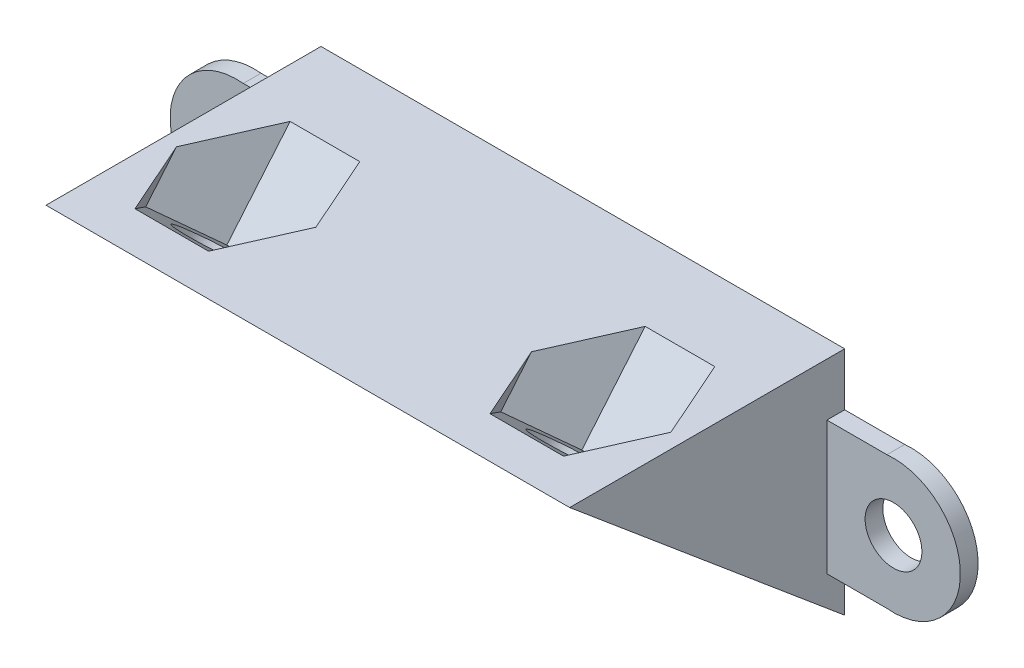
ISO-10303-21;
HEADER;
FILE_DESCRIPTION(('STEP AP214'),'2;1');
FILE_NAME('part.step','',(''),(''),'','','');
FILE_SCHEMA(('AUTOMOTIVE_DESIGN { 1 0 10303 214 1 1 1 1 }'));
ENDSEC;
DATA;
#1=APPLICATION_CONTEXT('core data for automotive mechanical design processes');
#2=APPLICATION_PROTOCOL_DEFINITION('international standard','automotive_design',2000,#1);
#3=PRODUCT_CONTEXT('',#1,'mechanical');
#4=PRODUCT('Part','Part','',(#3));
#5=PRODUCT_RELATED_PRODUCT_CATEGORY('part','',(#4));
#6=PRODUCT_DEFINITION_FORMATION('','',#4);
#7=PRODUCT_DEFINITION_CONTEXT('part definition',#1,'design');
#8=PRODUCT_DEFINITION('design','',#6,#7);
#9=PRODUCT_DEFINITION_SHAPE('','',#8);
#10=(LENGTH_UNIT() NAMED_UNIT(*) SI_UNIT(.MILLI.,.METRE.));
#11=(NAMED_UNIT(*) PLANE_ANGLE_UNIT() SI_UNIT($,.RADIAN.));
#12=(NAMED_UNIT(*) SI_UNIT($,.STERADIAN.) SOLID_ANGLE_UNIT());
#13=UNCERTAINTY_MEASURE_WITH_UNIT(LENGTH_MEASURE(1.E-05),#10,'distance_accuracy_value','');
#14=(GEOMETRIC_REPRESENTATION_CONTEXT(3) GLOBAL_UNCERTAINTY_ASSIGNED_CONTEXT((#13)) GLOBAL_UNIT_ASSIGNED_CONTEXT((#10,
#11,#12)) REPRESENTATION_CONTEXT('',''));
#15=CARTESIAN_POINT('',(0.,0.,0.));
#16=DIRECTION('',(0.,0.,1.));
#17=DIRECTION('',(1.,0.,0.));
#18=AXIS2_PLACEMENT_3D('',#15,#16,#17);
#19=CARTESIAN_POINT('',(0.,0.,1.));
#20=DIRECTION('',(0.,0.,1.));
#21=DIRECTION('',(1.,0.,0.));
#22=AXIS2_PLACEMENT_3D('',#19,#20,#21);
#23=PLANE('',#22);
#24=DIRECTION('',(0.,1.,0.));
#25=VECTOR('',#24,1.);
#26=CARTESIAN_POINT('',(0.,0.,1.));
#27=LINE('',#26,#25);
#28=CARTESIAN_POINT('',(0.,2.52312353150434,1.));
#29=VERTEX_POINT('',#28);
#30=CARTESIAN_POINT('',(0.,10.0231235315043,1.));
#31=VERTEX_POINT('',#30);
#32=EDGE_CURVE('E348',#29,#31,#27,.T.);
#33=ORIENTED_EDGE('',*,*,#32,.F.);
#34=DIRECTION('',(-1.,0.,0.));
#35=VECTOR('',#34,1.);
#36=CARTESIAN_POINT('',(0.,2.52312353150434,1.));
#37=LINE('',#36,#35);
#38=CARTESIAN_POINT('',(3.37999999999996,2.52312353150434,1.));
#39=VERTEX_POINT('',#38);
#40=EDGE_CURVE('E241',#39,#29,#37,.T.);
#41=ORIENTED_EDGE('',*,*,#40,.F.);
#42=CARTESIAN_POINT('',(3.75,6.27312353150434,1.));
#43=DIRECTION('',(0.,0.,1.));
#44=DIRECTION('',(1.,0.,0.));
#45=AXIS2_PLACEMENT_3D('',#42,#43,#44);
#46=CIRCLE('',#45,3.76820912370851);
#47=CARTESIAN_POINT('',(3.37999999999996,10.0231235315043,1.));
#48=VERTEX_POINT('',#47);
#49=EDGE_CURVE('E353',#48,#39,#46,.F.);
#50=ORIENTED_EDGE('',*,*,#49,.F.);
#51=DIRECTION('',(1.,0.,0.));
#52=VECTOR('',#51,1.);
#53=CARTESIAN_POINT('',(0.,10.0231235315043,1.));
#54=LINE('',#53,#52);
#55=EDGE_CURVE('E356',#31,#48,#54,.T.);
#56=ORIENTED_EDGE('',*,*,#55,.F.);
#57=EDGE_LOOP('',(#33,#41,#50,#56));
#58=FACE_BOUND('',#57,.T.);
#59=CARTESIAN_POINT('',(3.75,6.27312353150434,1.));
#60=DIRECTION('',(0.,0.,1.));
#61=DIRECTION('',(1.,0.,0.));
#62=AXIS2_PLACEMENT_3D('',#59,#60,#61);
#63=CIRCLE('',#62,1.59999999999999);
#64=CARTESIAN_POINT('',(5.34999999999999,6.27312353150434,1.));
#65=VERTEX_POINT('',#64);
#66=EDGE_CURVE('E368',#65,#65,#63,.T.);
#67=ORIENTED_EDGE('',*,*,#66,.F.);
#68=EDGE_LOOP('',(#67));
#69=FACE_BOUND('',#68,.T.);
#70=ADVANCED_FACE('F37',(#58,#69),#23,.T.);
#71=DIRECTION('',(0.,-1.,0.));
#72=VECTOR('',#71,1.);
#73=CARTESIAN_POINT('',(-29.5,0.,1.));
#74=LINE('',#73,#72);
#75=CARTESIAN_POINT('',(-29.5,10.0231235315044,1.));
#76=VERTEX_POINT('',#75);
#77=CARTESIAN_POINT('',(-29.5,2.52312353150435,1.));
#78=VERTEX_POINT('',#77);
#79=EDGE_CURVE('E193',#76,#78,#74,.T.);
#80=ORIENTED_EDGE('',*,*,#79,.F.);
#81=DIRECTION('',(0.999985346777663,0.0054135228786383,0.));
#82=VECTOR('',#81,1.);
#83=CARTESIAN_POINT('',(-0.0551241472471335,10.1825263763572,1.));
#84=LINE('',#83,#82);
#85=CARTESIAN_POINT('',(-32.88,10.0048255560503,1.));
#86=VERTEX_POINT('',#85);
#87=EDGE_CURVE('E359',#86,#76,#84,.T.);
#88=ORIENTED_EDGE('',*,*,#87,.F.);
#89=CARTESIAN_POINT('',(-33.25,6.27312353150435,1.));
#90=DIRECTION('',(0.,0.,1.));
#91=DIRECTION('',(1.,0.,0.));
#92=AXIS2_PLACEMENT_3D('',#89,#90,#91);
#93=CIRCLE('',#92,3.75);
#94=CARTESIAN_POINT('',(-32.88,2.54142150695845,1.));
#95=VERTEX_POINT('',#94);
#96=EDGE_CURVE('E362',#95,#86,#93,.F.);
#97=ORIENTED_EDGE('',*,*,#96,.F.);
#98=DIRECTION('',(-0.999985346777663,0.00541352287863894,0.));
#99=VECTOR('',#98,1.);
#100=CARTESIAN_POINT('',(0.0127942530315106,2.36335300344993,1.));
#101=LINE('',#100,#99);
#102=EDGE_CURVE('E365',#78,#95,#101,.T.);
#103=ORIENTED_EDGE('',*,*,#102,.F.);
#104=EDGE_LOOP('',(#80,#88,#97,#103));
#105=FACE_BOUND('',#104,.T.);
#106=CARTESIAN_POINT('',(-33.25,6.27312353150435,1.));
#107=DIRECTION('',(0.,0.,1.));
#108=DIRECTION('',(1.,0.,0.));
#109=AXIS2_PLACEMENT_3D('',#106,#107,#108);
#110=CIRCLE('',#109,1.59999999999999);
#111=CARTESIAN_POINT('',(-31.65,6.27312353150435,1.));
#112=VERTEX_POINT('',#111);
#113=EDGE_CURVE('E245',#112,#112,#110,.T.);
#114=ORIENTED_EDGE('',*,*,#113,.F.);
#115=EDGE_LOOP('',(#114));
#116=FACE_BOUND('',#115,.T.);
#117=ADVANCED_FACE('F394',(#105,#116),#23,.T.);
#118=CARTESIAN_POINT('',(0.,2.52312353150434,1.));
#119=DIRECTION('',(0.,-1.,0.));
#120=DIRECTION('',(1.,0.,0.));
#121=AXIS2_PLACEMENT_3D('',#118,#119,#120);
#122=PLANE('',#121);
#123=DIRECTION('',(-1.,0.,0.));
#124=VECTOR('',#123,1.);
#125=CARTESIAN_POINT('',(0.,2.52312353150434,0.));
#126=LINE('',#125,#124);
#127=CARTESIAN_POINT('',(3.37999999999996,2.52312353150434,0.));
#128=VERTEX_POINT('',#127);
#129=CARTESIAN_POINT('',(0.,2.52312353150434,0.));
#130=VERTEX_POINT('',#129);
#131=EDGE_CURVE('E211',#128,#130,#126,.T.);
#132=ORIENTED_EDGE('',*,*,#131,.F.);
#133=DIRECTION('',(0.,0.,-1.));
#134=VECTOR('',#133,1.);
#135=CARTESIAN_POINT('',(3.37999999999996,2.52312353150434,1.));
#136=LINE('',#135,#134);
#137=EDGE_CURVE('E258',#39,#128,#136,.T.);
#138=ORIENTED_EDGE('',*,*,#137,.F.);
#139=ORIENTED_EDGE('',*,*,#40,.T.);
#140=DIRECTION('',(0.,0.,-1.));
#141=VECTOR('',#140,1.);
#142=CARTESIAN_POINT('',(0.,2.52312353150434,1.));
#143=LINE('',#142,#141);
#144=EDGE_CURVE('E260',#29,#130,#143,.T.);
#145=ORIENTED_EDGE('',*,*,#144,.T.);
#146=EDGE_LOOP('',(#132,#138,#139,#145));
#147=FACE_BOUND('',#146,.T.);
#148=ADVANCED_FACE('F39',(#147),#122,.T.);
#149=CARTESIAN_POINT('',(3.75,6.27312353150434,1.));
#150=DIRECTION('',(0.,0.,-1.));
#151=DIRECTION('',(-1.,0.,0.));
#152=AXIS2_PLACEMENT_3D('',#149,#150,#151);
#153=CYLINDRICAL_SURFACE('',#152,3.76820912370851);
#154=CARTESIAN_POINT('',(3.75,6.27312353150434,0.));
#155=DIRECTION('',(0.,0.,1.));
#156=DIRECTION('',(1.,0.,0.));
#157=AXIS2_PLACEMENT_3D('',#154,#155,#156);
#158=CIRCLE('',#157,3.76820912370851);
#159=CARTESIAN_POINT('',(3.37999999999996,10.0231235315043,0.));
#160=VERTEX_POINT('',#159);
#161=EDGE_CURVE('E214',#160,#128,#158,.F.);
#162=ORIENTED_EDGE('',*,*,#161,.F.);
#163=DIRECTION('',(0.,0.,-1.));
#164=VECTOR('',#163,1.);
#165=CARTESIAN_POINT('',(3.37999999999996,10.0231235315043,1.));
#166=LINE('',#165,#164);
#167=EDGE_CURVE('E256',#48,#160,#166,.T.);
#168=ORIENTED_EDGE('',*,*,#167,.F.);
#169=ORIENTED_EDGE('',*,*,#49,.T.);
#170=ORIENTED_EDGE('',*,*,#137,.T.);
#171=EDGE_LOOP('',(#162,#168,#169,#170));
#172=FACE_BOUND('',#171,.T.);
#173=ADVANCED_FACE('F388',(#172),#153,.T.);
#174=CARTESIAN_POINT('',(0.,10.0231235315043,1.));
#175=DIRECTION('',(0.,1.,0.));
#176=DIRECTION('',(-1.,0.,0.));
#177=AXIS2_PLACEMENT_3D('',#174,#175,#176);
#178=PLANE('',#177);
#179=DIRECTION('',(1.,0.,0.));
#180=VECTOR('',#179,1.);
#181=CARTESIAN_POINT('',(0.,10.0231235315043,0.));
#182=LINE('',#181,#180);
#183=CARTESIAN_POINT('',(0.,10.0231235315043,0.));
#184=VERTEX_POINT('',#183);
#185=EDGE_CURVE('E218',#184,#160,#182,.T.);
#186=ORIENTED_EDGE('',*,*,#185,.F.);
#187=DIRECTION('',(0.,0.,-1.));
#188=VECTOR('',#187,1.);
#189=CARTESIAN_POINT('',(0.,10.0231235315043,1.));
#190=LINE('',#189,#188);
#191=EDGE_CURVE('E254',#31,#184,#190,.T.);
#192=ORIENTED_EDGE('',*,*,#191,.F.);
#193=ORIENTED_EDGE('',*,*,#55,.T.);
#194=ORIENTED_EDGE('',*,*,#167,.T.);
#195=EDGE_LOOP('',(#186,#192,#193,#194));
#196=FACE_BOUND('',#195,.T.);
#197=ADVANCED_FACE('F384',(#196),#178,.T.);
#198=CARTESIAN_POINT('',(0.,0.,1.));
#199=DIRECTION('',(1.,0.,0.));
#200=DIRECTION('',(0.,1.,0.));
#201=AXIS2_PLACEMENT_3D('',#198,#199,#200);
#202=PLANE('',#201);
#203=DIRECTION('',(0.,-0.642787609686538,-0.766044443118979));
#204=VECTOR('',#203,1.);
#205=CARTESIAN_POINT('',(0.,24.0989079094288,28.7199600786589));
#206=LINE('',#205,#204);
#207=CARTESIAN_POINT('',(0.,13.,15.4927967037247));
#208=VERTEX_POINT('',#207);
#209=CARTESIAN_POINT('',(0.,0.,0.));
#210=VERTEX_POINT('',#209);
#211=EDGE_CURVE('E181',#208,#210,#206,.T.);
#212=ORIENTED_EDGE('',*,*,#211,.T.);
#213=DIRECTION('',(0.,-1.,0.));
#214=VECTOR('',#213,1.);
#215=CARTESIAN_POINT('',(0.,0.,0.));
#216=LINE('',#215,#214);
#217=EDGE_CURVE('E186',#130,#210,#216,.T.);
#218=ORIENTED_EDGE('',*,*,#217,.F.);
#219=ORIENTED_EDGE('',*,*,#144,.F.);
#220=ORIENTED_EDGE('',*,*,#32,.T.);
#221=ORIENTED_EDGE('',*,*,#191,.T.);
#222=CARTESIAN_POINT('',(0.,13.,0.));
#223=VERTEX_POINT('',#222);
#224=EDGE_CURVE('E213',#223,#184,#216,.T.);
#225=ORIENTED_EDGE('',*,*,#224,.F.);
#226=DIRECTION('',(0.,0.,-1.));
#227=VECTOR('',#226,1.);
#228=CARTESIAN_POINT('',(0.,13.,1.));
#229=LINE('',#228,#227);
#230=EDGE_CURVE('E189',#208,#223,#229,.T.);
#231=ORIENTED_EDGE('',*,*,#230,.F.);
#232=EDGE_LOOP('',(#212,#218,#219,#220,#221,#225,#231));
#233=FACE_BOUND('',#232,.T.);
#234=ADVANCED_FACE('F183',(#233),#202,.T.);
#235=CARTESIAN_POINT('',(0.,13.,1.));
#236=DIRECTION('',(0.,1.,0.));
#237=DIRECTION('',(-1.,0.,0.));
#238=AXIS2_PLACEMENT_3D('',#235,#236,#237);
#239=PLANE('',#238);
#240=DIRECTION('',(-0.404481746652007,0.,-0.91454607135198));
#241=VECTOR('',#240,1.);
#242=CARTESIAN_POINT('',(-3.63587594767836,13.,2.60806054500119));
#243=LINE('',#242,#241);
#244=CARTESIAN_POINT('',(-0.824018169510542,13.,8.96576025706341));
#245=VERTEX_POINT('',#244);
#246=CARTESIAN_POINT('',(-2.78700908475527,13.,4.52737547333366));
#247=VERTEX_POINT('',#246);
#248=EDGE_CURVE('E11',#245,#247,#243,.T.);
#249=ORIENTED_EDGE('',*,*,#248,.F.);
#250=DIRECTION('',(0.404481746652007,0.,-0.914546071351981));
#251=VECTOR('',#250,1.);
#252=CARTESIAN_POINT('',(2.25746739052182,13.,1.99842356960581));
#253=LINE('',#252,#251);
#254=CARTESIAN_POINT('',(-2.67868062922069,13.,13.1592109634341));
#255=VERTEX_POINT('',#254);
#256=EDGE_CURVE('E272',#255,#245,#253,.T.);
#257=ORIENTED_EDGE('',*,*,#256,.F.);
#258=DIRECTION('',(1.,0.,0.));
#259=VECTOR('',#258,1.);
#260=CARTESIAN_POINT('',(0.,13.,13.1592109634341));
#261=LINE('',#260,#259);
#262=CARTESIAN_POINT('',(-6.8213193707793,13.,13.1592109634341));
#263=VERTEX_POINT('',#262);
#264=EDGE_CURVE('E294',#263,#255,#261,.T.);
#265=ORIENTED_EDGE('',*,*,#264,.F.);
#266=DIRECTION('',(0.404481746652007,0.,0.91454607135198));
#267=VECTOR('',#266,1.);
#268=CARTESIAN_POINT('',(-10.2032152984626,13.,5.51263689678053));
#269=LINE('',#268,#267);
#270=CARTESIAN_POINT('',(-8.67598183048946,13.,8.96576025706341));
#271=VERTEX_POINT('',#270);
#272=EDGE_CURVE('E274',#271,#263,#269,.T.);
#273=ORIENTED_EDGE('',*,*,#272,.F.);
#274=DIRECTION('',(-0.404481746652006,0.,0.914546071351981));
#275=VECTOR('',#274,1.);
#276=CARTESIAN_POINT('',(-4.30987196026239,13.,-0.90615278217352));
#277=LINE('',#276,#275);
#278=CARTESIAN_POINT('',(-6.71299091524473,13.,4.52737547333366));
#279=VERTEX_POINT('',#278);
#280=EDGE_CURVE('E276',#279,#271,#277,.T.);
#281=ORIENTED_EDGE('',*,*,#280,.F.);
#282=DIRECTION('',(-1.,0.,0.));
#283=VECTOR('',#282,1.);
#284=CARTESIAN_POINT('',(0.,13.,4.52737547333367));
#285=LINE('',#284,#283);
#286=EDGE_CURVE('E45',#247,#279,#285,.T.);
#287=ORIENTED_EDGE('',*,*,#286,.F.);
#288=EDGE_LOOP('',(#249,#257,#265,#273,#281,#287));
#289=FACE_BOUND('',#288,.T.);
#290=DIRECTION('',(-0.404481746652007,0.,-0.914546071351981));
#291=VECTOR('',#290,1.);
#292=CARTESIAN_POINT('',(-20.3637662801852,13.,10.0064043916848));
#293=LINE('',#292,#291);
#294=CARTESIAN_POINT('',(-20.8240181695105,13.,8.96576025706341));
#295=VERTEX_POINT('',#294);
#296=CARTESIAN_POINT('',(-22.7870090847553,13.,4.52737547333367));
#297=VERTEX_POINT('',#296);
#298=EDGE_CURVE('E270',#295,#297,#293,.T.);
#299=ORIENTED_EDGE('',*,*,#298,.F.);
#300=DIRECTION('',(0.404481746652007,0.,-0.914546071351981));
#301=VECTOR('',#300,1.);
#302=CARTESIAN_POINT('',(-14.470422941985,13.,-5.39992027707779));
#303=LINE('',#302,#301);
#304=CARTESIAN_POINT('',(-22.6786806292207,13.,13.1592109634342));
#305=VERTEX_POINT('',#304);
#306=EDGE_CURVE('E262',#305,#295,#303,.T.);
#307=ORIENTED_EDGE('',*,*,#306,.F.);
#308=DIRECTION('',(1.,0.,0.));
#309=VECTOR('',#308,1.);
#310=CARTESIAN_POINT('',(0.,13.,13.1592109634341));
#311=LINE('',#310,#309);
#312=CARTESIAN_POINT('',(-26.8213193707793,13.,13.1592109634342));
#313=VERTEX_POINT('',#312);
#314=EDGE_CURVE('E336',#313,#305,#311,.T.);
#315=ORIENTED_EDGE('',*,*,#314,.F.);
#316=DIRECTION('',(0.404481746652007,0.,0.914546071351981));
#317=VECTOR('',#316,1.);
#318=CARTESIAN_POINT('',(-26.9311056309694,13.,12.9109807434641));
#319=LINE('',#318,#317);
#320=CARTESIAN_POINT('',(-28.6759818304894,13.,8.9657602570634));
#321=VERTEX_POINT('',#320);
#322=EDGE_CURVE('E264',#321,#313,#319,.T.);
#323=ORIENTED_EDGE('',*,*,#322,.F.);
#324=DIRECTION('',(-0.404481746652006,0.,0.914546071351981));
#325=VECTOR('',#324,1.);
#326=CARTESIAN_POINT('',(-21.0377622927692,13.,-8.30449662885711));
#327=LINE('',#326,#325);
#328=CARTESIAN_POINT('',(-26.7129909152447,13.,4.52737547333367));
#329=VERTEX_POINT('',#328);
#330=EDGE_CURVE('E266',#329,#321,#327,.T.);
#331=ORIENTED_EDGE('',*,*,#330,.F.);
#332=DIRECTION('',(-1.,0.,0.));
#333=VECTOR('',#332,1.);
#334=CARTESIAN_POINT('',(0.,13.,4.52737547333367));
#335=LINE('',#334,#333);
#336=EDGE_CURVE('E268',#297,#329,#335,.T.);
#337=ORIENTED_EDGE('',*,*,#336,.F.);
#338=EDGE_LOOP('',(#299,#307,#315,#323,#331,#337));
#339=FACE_BOUND('',#338,.T.);
#340=DIRECTION('',(1.,0.,0.));
#341=VECTOR('',#340,1.);
#342=CARTESIAN_POINT('',(0.,13.,0.));
#343=LINE('',#342,#341);
#344=CARTESIAN_POINT('',(-29.5,13.,0.));
#345=VERTEX_POINT('',#344);
#346=EDGE_CURVE('E217',#345,#223,#343,.T.);
#347=ORIENTED_EDGE('',*,*,#346,.F.);
#348=DIRECTION('',(0.,0.,-1.));
#349=VECTOR('',#348,1.);
#350=CARTESIAN_POINT('',(-29.5,13.,1.));
#351=LINE('',#350,#349);
#352=CARTESIAN_POINT('',(-29.5,13.,15.4927967037248));
#353=VERTEX_POINT('',#352);
#354=EDGE_CURVE('E251',#353,#345,#351,.T.);
#355=ORIENTED_EDGE('',*,*,#354,.F.);
#356=DIRECTION('',(1.,0.,0.));
#357=VECTOR('',#356,1.);
#358=CARTESIAN_POINT('',(0.,13.,15.4927967037247));
#359=LINE('',#358,#357);
#360=EDGE_CURVE('E194',#353,#208,#359,.T.);
#361=ORIENTED_EDGE('',*,*,#360,.T.);
#362=ORIENTED_EDGE('',*,*,#230,.T.);
#363=EDGE_LOOP('',(#347,#355,#361,#362));
#364=FACE_BOUND('',#363,.T.);
#365=ADVANCED_FACE('F298',(#289,#339,#364),#239,.T.);
#366=CARTESIAN_POINT('',(-29.5,0.,1.));
#367=DIRECTION('',(-1.,0.,0.));
#368=DIRECTION('',(0.,0.,1.));
#369=AXIS2_PLACEMENT_3D('',#366,#367,#368);
#370=PLANE('',#369);
#371=DIRECTION('',(0.,1.,0.));
#372=VECTOR('',#371,1.);
#373=CARTESIAN_POINT('',(-29.5,0.,0.));
#374=LINE('',#373,#372);
#375=CARTESIAN_POINT('',(-29.5,0.,0.));
#376=VERTEX_POINT('',#375);
#377=CARTESIAN_POINT('',(-29.5,2.52312353150435,0.));
#378=VERTEX_POINT('',#377);
#379=EDGE_CURVE('E204',#376,#378,#374,.T.);
#380=ORIENTED_EDGE('',*,*,#379,.F.);
#381=DIRECTION('',(0.,0.642787609686538,0.766044443118979));
#382=VECTOR('',#381,1.);
#383=CARTESIAN_POINT('',(-29.5,24.0989079094288,28.7199600786589));
#384=LINE('',#383,#382);
#385=EDGE_CURVE('E200',#376,#353,#384,.T.);
#386=ORIENTED_EDGE('',*,*,#385,.T.);
#387=ORIENTED_EDGE('',*,*,#354,.T.);
#388=CARTESIAN_POINT('',(-29.5,10.0231235315044,0.));
#389=VERTEX_POINT('',#388);
#390=EDGE_CURVE('E221',#389,#345,#374,.T.);
#391=ORIENTED_EDGE('',*,*,#390,.F.);
#392=DIRECTION('',(0.,0.,-1.));
#393=VECTOR('',#392,1.);
#394=CARTESIAN_POINT('',(-29.5,10.0231235315044,1.));
#395=LINE('',#394,#393);
#396=EDGE_CURVE('E249',#76,#389,#395,.T.);
#397=ORIENTED_EDGE('',*,*,#396,.F.);
#398=ORIENTED_EDGE('',*,*,#79,.T.);
#399=DIRECTION('',(0.,0.,-1.));
#400=VECTOR('',#399,1.);
#401=CARTESIAN_POINT('',(-29.5,2.52312353150435,1.));
#402=LINE('',#401,#400);
#403=EDGE_CURVE('E242',#78,#378,#402,.T.);
#404=ORIENTED_EDGE('',*,*,#403,.T.);
#405=EDGE_LOOP('',(#380,#386,#387,#391,#397,#398,#404));
#406=FACE_BOUND('',#405,.T.);
#407=ADVANCED_FACE('F380',(#406),#370,.T.);
#408=CARTESIAN_POINT('',(-0.0551241472471335,10.1825263763572,1.));
#409=DIRECTION('',(-0.0054135228786383,0.999985346777663,0.));
#410=DIRECTION('',(-0.999985346777663,-0.0054135228786383,0.));
#411=AXIS2_PLACEMENT_3D('',#408,#409,#410);
#412=PLANE('',#411);
#413=DIRECTION('',(0.999985346777663,0.0054135228786383,0.));
#414=VECTOR('',#413,1.);
#415=CARTESIAN_POINT('',(-0.0551241472471335,10.1825263763572,0.));
#416=LINE('',#415,#414);
#417=CARTESIAN_POINT('',(-32.88,10.0048255560503,0.));
#418=VERTEX_POINT('',#417);
#419=EDGE_CURVE('E227',#418,#389,#416,.T.);
#420=ORIENTED_EDGE('',*,*,#419,.F.);
#421=DIRECTION('',(0.,0.,-1.));
#422=VECTOR('',#421,1.);
#423=CARTESIAN_POINT('',(-32.88,10.0048255560503,1.));
#424=LINE('',#423,#422);
#425=EDGE_CURVE('E247',#86,#418,#424,.T.);
#426=ORIENTED_EDGE('',*,*,#425,.F.);
#427=ORIENTED_EDGE('',*,*,#87,.T.);
#428=ORIENTED_EDGE('',*,*,#396,.T.);
#429=EDGE_LOOP('',(#420,#426,#427,#428));
#430=FACE_BOUND('',#429,.T.);
#431=ADVANCED_FACE('F424',(#430),#412,.T.);
#432=CARTESIAN_POINT('',(-33.25,6.27312353150435,1.));
#433=DIRECTION('',(0.,0.,-1.));
#434=DIRECTION('',(-1.,0.,0.));
#435=AXIS2_PLACEMENT_3D('',#432,#433,#434);
#436=CYLINDRICAL_SURFACE('',#435,3.75);
#437=CARTESIAN_POINT('',(-33.25,6.27312353150435,0.));
#438=DIRECTION('',(0.,0.,1.));
#439=DIRECTION('',(1.,0.,0.));
#440=AXIS2_PLACEMENT_3D('',#437,#438,#439);
#441=CIRCLE('',#440,3.75);
#442=CARTESIAN_POINT('',(-32.88,2.54142150695845,0.));
#443=VERTEX_POINT('',#442);
#444=EDGE_CURVE('E229',#443,#418,#441,.F.);
#445=ORIENTED_EDGE('',*,*,#444,.F.);
#446=DIRECTION('',(0.,0.,-1.));
#447=VECTOR('',#446,1.);
#448=CARTESIAN_POINT('',(-32.88,2.54142150695845,1.));
#449=LINE('',#448,#447);
#450=EDGE_CURVE('E244',#95,#443,#449,.T.);
#451=ORIENTED_EDGE('',*,*,#450,.F.);
#452=ORIENTED_EDGE('',*,*,#96,.T.);
#453=ORIENTED_EDGE('',*,*,#425,.T.);
#454=EDGE_LOOP('',(#445,#451,#452,#453));
#455=FACE_BOUND('',#454,.T.);
#456=ADVANCED_FACE('F402',(#455),#436,.T.);
#457=CARTESIAN_POINT('',(3.75,6.27312353150434,1.));
#458=DIRECTION('',(0.,0.,-1.));
#459=DIRECTION('',(-1.,0.,0.));
#460=AXIS2_PLACEMENT_3D('',#457,#458,#459);
#461=CYLINDRICAL_SURFACE('',#460,1.59999999999999);
#462=ORIENTED_EDGE('',*,*,#66,.T.);
#463=EDGE_LOOP('',(#462));
#464=FACE_BOUND('',#463,.T.);
#465=CARTESIAN_POINT('',(3.75,6.27312353150434,0.));
#466=DIRECTION('',(0.,0.,1.));
#467=DIRECTION('',(1.,0.,0.));
#468=AXIS2_PLACEMENT_3D('',#465,#466,#467);
#469=CIRCLE('',#468,1.59999999999999);
#470=CARTESIAN_POINT('',(5.34999999999999,6.27312353150434,0.));
#471=VERTEX_POINT('',#470);
#472=EDGE_CURVE('E235',#471,#471,#469,.T.);
#473=ORIENTED_EDGE('',*,*,#472,.F.);
#474=EDGE_LOOP('',(#473));
#475=FACE_BOUND('',#474,.T.);
#476=ADVANCED_FACE('F398',(#464,#475),#461,.F.);
#477=CARTESIAN_POINT('',(0.0127942530315106,2.36335300344993,1.));
#478=DIRECTION('',(-0.00541352287863894,-0.999985346777663,0.));
#479=DIRECTION('',(0.999985346777663,-0.00541352287863894,0.));
#480=AXIS2_PLACEMENT_3D('',#477,#478,#479);
#481=PLANE('',#480);
#482=DIRECTION('',(-0.999985346777663,0.00541352287863894,0.));
#483=VECTOR('',#482,1.);
#484=CARTESIAN_POINT('',(0.0127942530315106,2.36335300344993,0.));
#485=LINE('',#484,#483);
#486=EDGE_CURVE('E232',#378,#443,#485,.T.);
#487=ORIENTED_EDGE('',*,*,#486,.F.);
#488=ORIENTED_EDGE('',*,*,#403,.F.);
#489=ORIENTED_EDGE('',*,*,#102,.T.);
#490=ORIENTED_EDGE('',*,*,#450,.T.);
#491=EDGE_LOOP('',(#487,#488,#489,#490));
#492=FACE_BOUND('',#491,.T.);
#493=ADVANCED_FACE('F401',(#492),#481,.T.);
#494=CARTESIAN_POINT('',(-33.25,6.27312353150435,1.));
#495=DIRECTION('',(0.,0.,-1.));
#496=DIRECTION('',(-1.,0.,0.));
#497=AXIS2_PLACEMENT_3D('',#494,#495,#496);
#498=CYLINDRICAL_SURFACE('',#497,1.59999999999999);
#499=ORIENTED_EDGE('',*,*,#113,.T.);
#500=EDGE_LOOP('',(#499));
#501=FACE_BOUND('',#500,.T.);
#502=CARTESIAN_POINT('',(-33.25,6.27312353150435,0.));
#503=DIRECTION('',(0.,0.,1.));
#504=DIRECTION('',(1.,0.,0.));
#505=AXIS2_PLACEMENT_3D('',#502,#503,#504);
#506=CIRCLE('',#505,1.59999999999999);
#507=CARTESIAN_POINT('',(-31.65,6.27312353150435,0.));
#508=VERTEX_POINT('',#507);
#509=EDGE_CURVE('E238',#508,#508,#506,.T.);
#510=ORIENTED_EDGE('',*,*,#509,.F.);
#511=EDGE_LOOP('',(#510));
#512=FACE_BOUND('',#511,.T.);
#513=ADVANCED_FACE('F407',(#501,#512),#498,.F.);
#514=CARTESIAN_POINT('',(0.,0.,0.));
#515=DIRECTION('',(0.,0.,1.));
#516=DIRECTION('',(1.,0.,0.));
#517=AXIS2_PLACEMENT_3D('',#514,#515,#516);
#518=PLANE('',#517);
#519=ORIENTED_EDGE('',*,*,#419,.T.);
#520=ORIENTED_EDGE('',*,*,#390,.T.);
#521=ORIENTED_EDGE('',*,*,#346,.T.);
#522=ORIENTED_EDGE('',*,*,#224,.T.);
#523=ORIENTED_EDGE('',*,*,#185,.T.);
#524=ORIENTED_EDGE('',*,*,#161,.T.);
#525=ORIENTED_EDGE('',*,*,#131,.T.);
#526=ORIENTED_EDGE('',*,*,#217,.T.);
#527=DIRECTION('',(-1.,0.,0.));
#528=VECTOR('',#527,1.);
#529=CARTESIAN_POINT('',(0.,0.,0.));
#530=LINE('',#529,#528);
#531=EDGE_CURVE('E197',#210,#376,#530,.T.);
#532=ORIENTED_EDGE('',*,*,#531,.T.);
#533=ORIENTED_EDGE('',*,*,#379,.T.);
#534=ORIENTED_EDGE('',*,*,#486,.T.);
#535=ORIENTED_EDGE('',*,*,#444,.T.);
#536=EDGE_LOOP('',(#519,#520,#521,#522,#523,#524,#525,#526,#532,#533,#534,#535));
#537=FACE_BOUND('',#536,.T.);
#538=ORIENTED_EDGE('',*,*,#509,.T.);
#539=EDGE_LOOP('',(#538));
#540=FACE_BOUND('',#539,.T.);
#541=ORIENTED_EDGE('',*,*,#472,.T.);
#542=EDGE_LOOP('',(#541));
#543=FACE_BOUND('',#542,.T.);
#544=ADVANCED_FACE('F207',(#537,#540,#543),#518,.F.);
#545=CARTESIAN_POINT('',(69.6999999999984,140.463545208397,167.397934630627));
#546=DIRECTION('',(0.,-0.766044443118979,0.642787609686538));
#547=DIRECTION('',(0.,-0.642787609686538,-0.766044443118979));
#548=AXIS2_PLACEMENT_3D('',#545,#546,#547);
#549=PLANE('',#548);
#550=CARTESIAN_POINT('',(-4.75,9.7860619515673,11.6625744881299));
#551=DIRECTION('',(0.,-0.766044443118979,0.642787609686538));
#552=DIRECTION('',(0.,-0.642787609686538,-0.766044443118979));
#553=AXIS2_PLACEMENT_3D('',#550,#551,#552);
#554=CIRCLE('',#553,2.);
#555=CARTESIAN_POINT('',(-4.75,8.50048673219422,10.1304856018919));
#556=VERTEX_POINT('',#555);
#557=EDGE_CURVE('E339',#556,#556,#554,.T.);
#558=ORIENTED_EDGE('',*,*,#557,.F.);
#559=EDGE_LOOP('',(#558));
#560=FACE_BOUND('',#559,.T.);
#561=CARTESIAN_POINT('',(-24.75,9.78606195156729,11.6625744881299));
#562=DIRECTION('',(0.,-0.766044443118979,0.642787609686538));
#563=DIRECTION('',(0.,-0.642787609686538,-0.766044443118979));
#564=AXIS2_PLACEMENT_3D('',#561,#562,#563);
#565=CIRCLE('',#564,2.);
#566=CARTESIAN_POINT('',(-24.75,8.50048673219421,10.1304856018919));
#567=VERTEX_POINT('',#566);
#568=EDGE_CURVE('E338',#567,#567,#565,.T.);
#569=ORIENTED_EDGE('',*,*,#568,.F.);
#570=EDGE_LOOP('',(#569));
#571=FACE_BOUND('',#570,.T.);
#572=ORIENTED_EDGE('',*,*,#385,.F.);
#573=ORIENTED_EDGE('',*,*,#531,.F.);
#574=ORIENTED_EDGE('',*,*,#211,.F.);
#575=ORIENTED_EDGE('',*,*,#360,.F.);
#576=EDGE_LOOP('',(#572,#573,#574,#575));
#577=FACE_BOUND('',#576,.T.);
#578=ADVANCED_FACE('F198',(#560,#571,#577),#549,.T.);
#579=CARTESIAN_POINT('',(-24.75,17.4147751064024,5.26132409355054));
#580=DIRECTION('',(0.,-0.766044443118979,0.642787609686538));
#581=DIRECTION('',(0.,-0.642787609686538,-0.766044443118979));
#582=AXIS2_PLACEMENT_3D('',#579,#580,#581);
#583=CYLINDRICAL_SURFACE('',#582,2.);
#584=CARTESIAN_POINT('',(-24.75,10.9351286162458,10.6983930736001));
#585=DIRECTION('',(0.,-0.766044443118979,0.642787609686538));
#586=DIRECTION('',(0.,-0.642787609686538,-0.766044443118979));
#587=AXIS2_PLACEMENT_3D('',#584,#585,#586);
#588=CIRCLE('',#587,2.);
#589=CARTESIAN_POINT('',(-24.75,9.64955339687268,9.16630418736213));
#590=VERTEX_POINT('',#589);
#591=EDGE_CURVE('E310',#590,#590,#588,.T.);
#592=ORIENTED_EDGE('',*,*,#591,.F.);
#593=EDGE_LOOP('',(#592));
#594=FACE_BOUND('',#593,.T.);
#595=ORIENTED_EDGE('',*,*,#568,.T.);
#596=EDGE_LOOP('',(#595));
#597=FACE_BOUND('',#596,.T.);
#598=ADVANCED_FACE('F413',(#594,#597),#583,.F.);
#599=CARTESIAN_POINT('',(-4.75,17.4147751064024,5.26132409355053));
#600=DIRECTION('',(0.,-0.766044443118979,0.642787609686538));
#601=DIRECTION('',(0.,-0.642787609686538,-0.766044443118979));
#602=AXIS2_PLACEMENT_3D('',#599,#600,#601);
#603=CYLINDRICAL_SURFACE('',#602,2.);
#604=CARTESIAN_POINT('',(-4.75,10.9351286162458,10.6983930736001));
#605=DIRECTION('',(0.,-0.766044443118979,0.642787609686538));
#606=DIRECTION('',(0.,-0.642787609686538,-0.766044443118979));
#607=AXIS2_PLACEMENT_3D('',#604,#605,#606);
#608=CIRCLE('',#607,2.);
#609=CARTESIAN_POINT('',(-4.75,9.64955339687269,9.16630418736211));
#610=VERTEX_POINT('',#609);
#611=EDGE_CURVE('E329',#610,#610,#608,.T.);
#612=ORIENTED_EDGE('',*,*,#611,.F.);
#613=EDGE_LOOP('',(#612));
#614=FACE_BOUND('',#613,.T.);
#615=ORIENTED_EDGE('',*,*,#557,.T.);
#616=EDGE_LOOP('',(#615));
#617=FACE_BOUND('',#616,.T.);
#618=ADVANCED_FACE('F549',(#614,#617),#603,.F.);
#619=CARTESIAN_POINT('',(-6.71299091524473,15.2292972334681,2.656772986946));
#620=DIRECTION('',(0.,-0.642787609686538,-0.766044443118979));
#621=DIRECTION('',(0.,0.766044443118979,-0.642787609686538));
#622=AXIS2_PLACEMENT_3D('',#619,#620,#621);
#623=PLANE('',#622);
#624=ORIENTED_EDGE('',*,*,#286,.T.);
#625=DIRECTION('',(0.,-0.766044443118979,0.642787609686538));
#626=VECTOR('',#625,1.);
#627=CARTESIAN_POINT('',(-6.71299091524473,15.2292972334681,2.656772986946));
#628=LINE('',#627,#626);
#629=CARTESIAN_POINT('',(-6.71299091524473,8.74965074331154,8.09384196699555));
#630=VERTEX_POINT('',#629);
#631=EDGE_CURVE('E283',#279,#630,#628,.T.);
#632=ORIENTED_EDGE('',*,*,#631,.T.);
#633=DIRECTION('',(1.,0.,0.));
#634=VECTOR('',#633,1.);
#635=CARTESIAN_POINT('',(-6.71299091524473,8.74965074331154,8.09384196699555));
#636=LINE('',#635,#634);
#637=CARTESIAN_POINT('',(-2.78700908475527,8.74965074331154,8.09384196699554));
#638=VERTEX_POINT('',#637);
#639=EDGE_CURVE('E761',#630,#638,#636,.T.);
#640=ORIENTED_EDGE('',*,*,#639,.T.);
#641=DIRECTION('',(0.,-0.766044443118979,0.642787609686538));
#642=VECTOR('',#641,1.);
#643=CARTESIAN_POINT('',(-2.78700908475527,15.2292972334681,2.656772986946));
#644=LINE('',#643,#642);
#645=EDGE_CURVE('E285',#247,#638,#644,.T.);
#646=ORIENTED_EDGE('',*,*,#645,.F.);
#647=EDGE_LOOP('',(#624,#632,#640,#646));
#648=FACE_BOUND('',#647,.T.);
#649=ADVANCED_FACE('F281',(#648),#623,.F.);
#650=CARTESIAN_POINT('',(-8.67598183048946,17.4147751064024,5.26132409355053));
#651=DIRECTION('',(-0.866025403784439,-0.32139380484327,-0.383022221559489));
#652=DIRECTION('',(-0.404481746652006,0.,0.914546071351981));
#653=AXIS2_PLACEMENT_3D('',#650,#651,#652);
#654=PLANE('',#653);
#655=ORIENTED_EDGE('',*,*,#280,.T.);
#656=DIRECTION('',(0.,-0.766044443118979,0.642787609686538));
#657=VECTOR('',#656,1.);
#658=CARTESIAN_POINT('',(-8.67598183048946,17.4147751064024,5.26132409355053));
#659=LINE('',#658,#657);
#660=CARTESIAN_POINT('',(-8.67598183048946,10.9351286162458,10.6983930736001));
#661=VERTEX_POINT('',#660);
#662=EDGE_CURVE('E295',#271,#661,#659,.T.);
#663=ORIENTED_EDGE('',*,*,#662,.T.);
#664=DIRECTION('',(0.5,-0.556670399226418,-0.663413948168939));
#665=VECTOR('',#664,1.);
#666=CARTESIAN_POINT('',(-8.67598183048946,10.9351286162458,10.6983930736001));
#667=LINE('',#666,#665);
#668=EDGE_CURVE('E293',#661,#630,#667,.T.);
#669=ORIENTED_EDGE('',*,*,#668,.T.);
#670=ORIENTED_EDGE('',*,*,#631,.F.);
#671=EDGE_LOOP('',(#655,#663,#669,#670));
#672=FACE_BOUND('',#671,.T.);
#673=ADVANCED_FACE('F291',(#672),#654,.F.);
#674=CARTESIAN_POINT('',(-6.71299091524473,19.6002529793366,7.86587520015506));
#675=DIRECTION('',(-0.866025403784438,0.321393804843269,0.38302222155949));
#676=DIRECTION('',(0.404481746652007,0.,0.91454607135198));
#677=AXIS2_PLACEMENT_3D('',#674,#675,#676);
#678=PLANE('',#677);
#679=ORIENTED_EDGE('',*,*,#272,.T.);
#680=DIRECTION('',(-0.5,-0.556670399226418,-0.663413948168939));
#681=VECTOR('',#680,1.);
#682=CARTESIAN_POINT('',(-6.71299091524473,13.12060648918,13.3029441802046));
#683=LINE('',#682,#681);
#684=EDGE_CURVE('E52',#263,#661,#683,.T.);
#685=ORIENTED_EDGE('',*,*,#684,.T.);
#686=ORIENTED_EDGE('',*,*,#662,.F.);
#687=EDGE_LOOP('',(#679,#685,#686));
#688=FACE_BOUND('',#687,.T.);
#689=ADVANCED_FACE('F303',(#688),#678,.F.);
#690=CARTESIAN_POINT('',(-0.824018169510546,17.4147751064024,5.26132409355053));
#691=DIRECTION('',(0.866025403784438,0.32139380484327,0.383022221559489));
#692=DIRECTION('',(0.404481746652006,0.,-0.914546071351981));
#693=AXIS2_PLACEMENT_3D('',#690,#691,#692);
#694=PLANE('',#693);
#695=ORIENTED_EDGE('',*,*,#256,.T.);
#696=DIRECTION('',(0.,-0.766044443118979,0.642787609686538));
#697=VECTOR('',#696,1.);
#698=CARTESIAN_POINT('',(-0.824018169510546,17.4147751064024,5.26132409355053));
#699=LINE('',#698,#697);
#700=CARTESIAN_POINT('',(-0.824018169510541,10.9351286162458,10.6983930736001));
#701=VERTEX_POINT('',#700);
#702=EDGE_CURVE('E304',#245,#701,#699,.T.);
#703=ORIENTED_EDGE('',*,*,#702,.T.);
#704=DIRECTION('',(-0.5,0.556670399226417,0.66341394816894));
#705=VECTOR('',#704,1.);
#706=CARTESIAN_POINT('',(-0.824018169510541,10.9351286162458,10.6983930736001));
#707=LINE('',#706,#705);
#708=EDGE_CURVE('E768',#701,#255,#707,.T.);
#709=ORIENTED_EDGE('',*,*,#708,.T.);
#710=EDGE_LOOP('',(#695,#703,#709));
#711=FACE_BOUND('',#710,.T.);
#712=ADVANCED_FACE('F585',(#711),#694,.F.);
#713=CARTESIAN_POINT('',(-2.78700908475527,15.2292972334681,2.656772986946));
#714=DIRECTION('',(0.866025403784439,-0.321393804843269,-0.38302222155949));
#715=DIRECTION('',(-0.404481746652007,0.,-0.91454607135198));
#716=AXIS2_PLACEMENT_3D('',#713,#714,#715);
#717=PLANE('',#716);
#718=ORIENTED_EDGE('',*,*,#248,.T.);
#719=ORIENTED_EDGE('',*,*,#645,.T.);
#720=DIRECTION('',(0.5,0.556670399226419,0.663413948168939));
#721=VECTOR('',#720,1.);
#722=CARTESIAN_POINT('',(-2.78700908475527,8.74965074331154,8.09384196699554));
#723=LINE('',#722,#721);
#724=EDGE_CURVE('E763',#638,#701,#723,.T.);
#725=ORIENTED_EDGE('',*,*,#724,.T.);
#726=ORIENTED_EDGE('',*,*,#702,.F.);
#727=EDGE_LOOP('',(#718,#719,#725,#726));
#728=FACE_BOUND('',#727,.T.);
#729=ADVANCED_FACE('F594',(#728),#717,.F.);
#730=CARTESIAN_POINT('',(0.,1.14906666467846,-0.964181414529804));
#731=DIRECTION('',(0.,-0.766044443118979,0.642787609686538));
#732=DIRECTION('',(0.,-0.642787609686538,-0.766044443118979));
#733=AXIS2_PLACEMENT_3D('',#730,#731,#732);
#734=PLANE('',#733);
#735=ORIENTED_EDGE('',*,*,#264,.T.);
#736=ORIENTED_EDGE('',*,*,#708,.F.);
#737=ORIENTED_EDGE('',*,*,#724,.F.);
#738=ORIENTED_EDGE('',*,*,#639,.F.);
#739=ORIENTED_EDGE('',*,*,#668,.F.);
#740=ORIENTED_EDGE('',*,*,#684,.F.);
#741=EDGE_LOOP('',(#735,#736,#737,#738,#739,#740));
#742=FACE_BOUND('',#741,.T.);
#743=ORIENTED_EDGE('',*,*,#611,.T.);
#744=EDGE_LOOP('',(#743));
#745=FACE_BOUND('',#744,.T.);
#746=ADVANCED_FACE('F604',(#742,#745),#734,.F.);
#747=CARTESIAN_POINT('',(-22.7870090847553,15.2292972334681,2.65677298694601));
#748=DIRECTION('',(0.866025403784439,-0.321393804843268,-0.38302222155949));
#749=DIRECTION('',(-0.404481746652007,0.,-0.914546071351981));
#750=AXIS2_PLACEMENT_3D('',#747,#748,#749);
#751=PLANE('',#750);
#752=ORIENTED_EDGE('',*,*,#298,.T.);
#753=DIRECTION('',(0.,-0.766044443118979,0.642787609686538));
#754=VECTOR('',#753,1.);
#755=CARTESIAN_POINT('',(-22.7870090847553,15.2292972334681,2.65677298694601));
#756=LINE('',#755,#754);
#757=CARTESIAN_POINT('',(-22.7870090847553,8.74965074331154,8.09384196699556));
#758=VERTEX_POINT('',#757);
#759=EDGE_CURVE('E327',#297,#758,#756,.T.);
#760=ORIENTED_EDGE('',*,*,#759,.T.);
#761=DIRECTION('',(0.5,0.556670399226418,0.663413948168939));
#762=VECTOR('',#761,1.);
#763=CARTESIAN_POINT('',(-22.7870090847553,8.74965074331154,8.09384196699556));
#764=LINE('',#763,#762);
#765=CARTESIAN_POINT('',(-20.8240181695105,10.9351286162458,10.6983930736001));
#766=VERTEX_POINT('',#765);
#767=EDGE_CURVE('E313',#758,#766,#764,.T.);
#768=ORIENTED_EDGE('',*,*,#767,.T.);
#769=DIRECTION('',(0.,-0.766044443118979,0.642787609686538));
#770=VECTOR('',#769,1.);
#771=CARTESIAN_POINT('',(-20.8240181695105,17.4147751064024,5.26132409355054));
#772=LINE('',#771,#770);
#773=EDGE_CURVE('E326',#295,#766,#772,.T.);
#774=ORIENTED_EDGE('',*,*,#773,.F.);
#775=EDGE_LOOP('',(#752,#760,#768,#774));
#776=FACE_BOUND('',#775,.T.);
#777=ADVANCED_FACE('F614',(#776),#751,.F.);
#778=CARTESIAN_POINT('',(-26.7129909152447,15.2292972334681,2.65677298694601));
#779=DIRECTION('',(0.,-0.642787609686538,-0.766044443118979));
#780=DIRECTION('',(0.,0.766044443118979,-0.642787609686538));
#781=AXIS2_PLACEMENT_3D('',#778,#779,#780);
#782=PLANE('',#781);
#783=ORIENTED_EDGE('',*,*,#336,.T.);
#784=DIRECTION('',(0.,-0.766044443118979,0.642787609686538));
#785=VECTOR('',#784,1.);
#786=CARTESIAN_POINT('',(-26.7129909152447,15.2292972334681,2.65677298694601));
#787=LINE('',#786,#785);
#788=CARTESIAN_POINT('',(-26.7129909152447,8.74965074331154,8.09384196699556));
#789=VERTEX_POINT('',#788);
#790=EDGE_CURVE('E330',#329,#789,#787,.T.);
#791=ORIENTED_EDGE('',*,*,#790,.T.);
#792=DIRECTION('',(1.,0.,0.));
#793=VECTOR('',#792,1.);
#794=CARTESIAN_POINT('',(-26.7129909152447,8.74965074331154,8.09384196699556));
#795=LINE('',#794,#793);
#796=EDGE_CURVE('E323',#789,#758,#795,.T.);
#797=ORIENTED_EDGE('',*,*,#796,.T.);
#798=ORIENTED_EDGE('',*,*,#759,.F.);
#799=EDGE_LOOP('',(#783,#791,#797,#798));
#800=FACE_BOUND('',#799,.T.);
#801=ADVANCED_FACE('F623',(#800),#782,.F.);
#802=CARTESIAN_POINT('',(-28.6759818304895,17.4147751064024,5.26132409355054));
#803=DIRECTION('',(-0.866025403784439,-0.321393804843269,-0.383022221559489));
#804=DIRECTION('',(-0.404481746652006,0.,0.914546071351981));
#805=AXIS2_PLACEMENT_3D('',#802,#803,#804);
#806=PLANE('',#805);
#807=ORIENTED_EDGE('',*,*,#330,.T.);
#808=DIRECTION('',(0.,-0.766044443118979,0.642787609686538));
#809=VECTOR('',#808,1.);
#810=CARTESIAN_POINT('',(-28.6759818304895,17.4147751064024,5.26132409355054));
#811=LINE('',#810,#809);
#812=CARTESIAN_POINT('',(-28.6759818304894,10.9351286162458,10.6983930736001));
#813=VERTEX_POINT('',#812);
#814=EDGE_CURVE('E332',#321,#813,#811,.T.);
#815=ORIENTED_EDGE('',*,*,#814,.T.);
#816=DIRECTION('',(0.5,-0.556670399226418,-0.66341394816894));
#817=VECTOR('',#816,1.);
#818=CARTESIAN_POINT('',(-28.6759818304894,10.9351286162458,10.6983930736001));
#819=LINE('',#818,#817);
#820=EDGE_CURVE('E320',#813,#789,#819,.T.);
#821=ORIENTED_EDGE('',*,*,#820,.T.);
#822=ORIENTED_EDGE('',*,*,#790,.F.);
#823=EDGE_LOOP('',(#807,#815,#821,#822));
#824=FACE_BOUND('',#823,.T.);
#825=ADVANCED_FACE('F633',(#824),#806,.F.);
#826=CARTESIAN_POINT('',(-26.7129909152447,19.6002529793366,7.86587520015506));
#827=DIRECTION('',(-0.866025403784439,0.321393804843269,0.38302222155949));
#828=DIRECTION('',(0.404481746652007,0.,0.91454607135198));
#829=AXIS2_PLACEMENT_3D('',#826,#827,#828);
#830=PLANE('',#829);
#831=ORIENTED_EDGE('',*,*,#322,.T.);
#832=DIRECTION('',(-0.5,-0.556670399226419,-0.663413948168939));
#833=VECTOR('',#832,1.);
#834=CARTESIAN_POINT('',(-26.7129909152447,13.12060648918,13.3029441802046));
#835=LINE('',#834,#833);
#836=EDGE_CURVE('E60',#313,#813,#835,.T.);
#837=ORIENTED_EDGE('',*,*,#836,.T.);
#838=ORIENTED_EDGE('',*,*,#814,.F.);
#839=EDGE_LOOP('',(#831,#837,#838));
#840=FACE_BOUND('',#839,.T.);
#841=ADVANCED_FACE('F643',(#840),#830,.F.);
#842=CARTESIAN_POINT('',(-20.8240181695105,17.4147751064024,5.26132409355054));
#843=DIRECTION('',(0.866025403784438,0.32139380484327,0.383022221559489));
#844=DIRECTION('',(0.404481746652006,0.,-0.914546071351981));
#845=AXIS2_PLACEMENT_3D('',#842,#843,#844);
#846=PLANE('',#845);
#847=ORIENTED_EDGE('',*,*,#306,.T.);
#848=ORIENTED_EDGE('',*,*,#773,.T.);
#849=DIRECTION('',(-0.5,0.556670399226418,0.663413948168939));
#850=VECTOR('',#849,1.);
#851=CARTESIAN_POINT('',(-20.8240181695105,10.9351286162458,10.6983930736001));
#852=LINE('',#851,#850);
#853=EDGE_CURVE('E316',#766,#305,#852,.T.);
#854=ORIENTED_EDGE('',*,*,#853,.T.);
#855=EDGE_LOOP('',(#847,#848,#854));
#856=FACE_BOUND('',#855,.T.);
#857=ADVANCED_FACE('F653',(#856),#846,.F.);
#858=CARTESIAN_POINT('',(0.,1.14906666467846,-0.9641814145298));
#859=DIRECTION('',(0.,-0.766044443118979,0.642787609686538));
#860=DIRECTION('',(0.,-0.642787609686538,-0.766044443118979));
#861=AXIS2_PLACEMENT_3D('',#858,#859,#860);
#862=PLANE('',#861);
#863=ORIENTED_EDGE('',*,*,#314,.T.);
#864=ORIENTED_EDGE('',*,*,#853,.F.);
#865=ORIENTED_EDGE('',*,*,#767,.F.);
#866=ORIENTED_EDGE('',*,*,#796,.F.);
#867=ORIENTED_EDGE('',*,*,#820,.F.);
#868=ORIENTED_EDGE('',*,*,#836,.F.);
#869=EDGE_LOOP('',(#863,#864,#865,#866,#867,#868));
#870=FACE_BOUND('',#869,.T.);
#871=ORIENTED_EDGE('',*,*,#591,.T.);
#872=EDGE_LOOP('',(#871));
#873=FACE_BOUND('',#872,.T.);
#874=ADVANCED_FACE('F663',(#870,#873),#862,.F.);
#875=CLOSED_SHELL('',(#70,#117,#148,#173,#197,#234,#365,#407,#431,#456,#476,#493,#513,#544,#578,
#598,#618,#649,#673,#689,#712,#729,#746,#777,#801,#825,#841,#857,#874));
#876=MANIFOLD_SOLID_BREP('B2',#875);
#877=ADVANCED_BREP_SHAPE_REPRESENTATION('',(#18,#876),#14);
#878=SHAPE_DEFINITION_REPRESENTATION(#9,#877);
ENDSEC;
END-ISO-10303-21;
